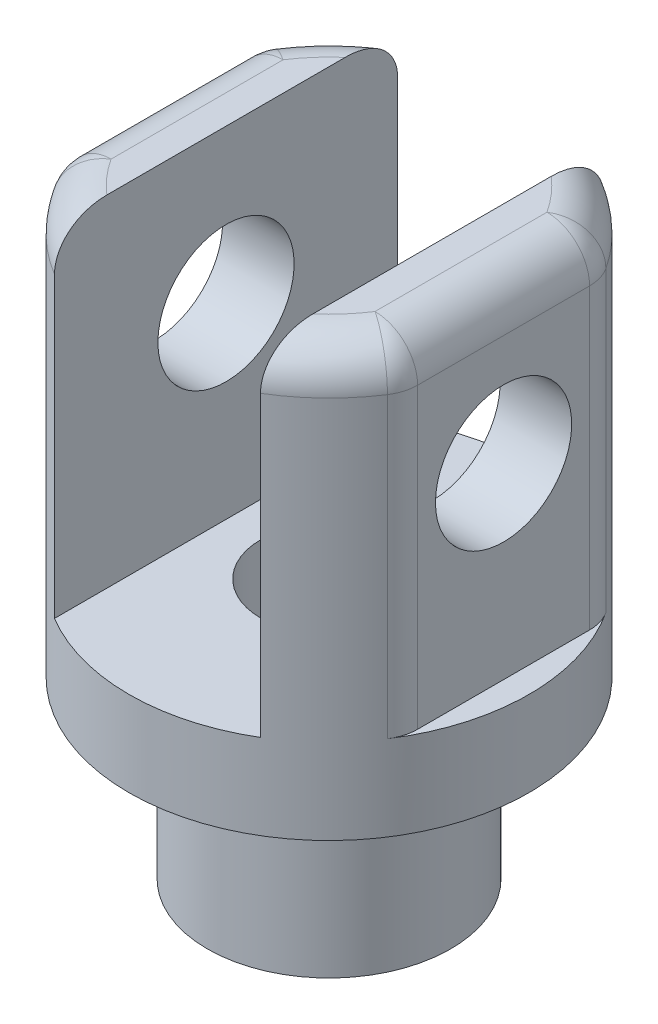
ISO-10303-21;
HEADER;
FILE_DESCRIPTION(('STEP AP214'),'2;1');
FILE_NAME('part.step','',(''),(''),'','','');
FILE_SCHEMA(('AUTOMOTIVE_DESIGN { 1 0 10303 214 1 1 1 1 }'));
ENDSEC;
DATA;
#1=APPLICATION_CONTEXT('core data for automotive mechanical design processes');
#2=APPLICATION_PROTOCOL_DEFINITION('international standard','automotive_design',2000,#1);
#3=PRODUCT_CONTEXT('',#1,'mechanical');
#4=PRODUCT('Part','Part','',(#3));
#5=PRODUCT_RELATED_PRODUCT_CATEGORY('part','',(#4));
#6=PRODUCT_DEFINITION_FORMATION('','',#4);
#7=PRODUCT_DEFINITION_CONTEXT('part definition',#1,'design');
#8=PRODUCT_DEFINITION('design','',#6,#7);
#9=PRODUCT_DEFINITION_SHAPE('','',#8);
#10=(LENGTH_UNIT() NAMED_UNIT(*) SI_UNIT(.MILLI.,.METRE.));
#11=(NAMED_UNIT(*) PLANE_ANGLE_UNIT() SI_UNIT($,.RADIAN.));
#12=(NAMED_UNIT(*) SI_UNIT($,.STERADIAN.) SOLID_ANGLE_UNIT());
#13=UNCERTAINTY_MEASURE_WITH_UNIT(LENGTH_MEASURE(1.E-05),#10,'distance_accuracy_value','');
#14=(GEOMETRIC_REPRESENTATION_CONTEXT(3) GLOBAL_UNCERTAINTY_ASSIGNED_CONTEXT((#13)) GLOBAL_UNIT_ASSIGNED_CONTEXT((#10,
#11,#12)) REPRESENTATION_CONTEXT('',''));
#15=CARTESIAN_POINT('',(0.,0.,0.));
#16=DIRECTION('',(0.,0.,1.));
#17=DIRECTION('',(1.,0.,0.));
#18=AXIS2_PLACEMENT_3D('',#15,#16,#17);
#19=CARTESIAN_POINT('',(0.,35.25,0.));
#20=DIRECTION('',(0.,-1.,0.));
#21=DIRECTION('',(0.,0.,-1.));
#22=AXIS2_PLACEMENT_3D('',#19,#20,#21);
#23=CYLINDRICAL_SURFACE('',#22,11.75);
#24=DIRECTION('',(0.,-1.,0.));
#25=VECTOR('',#24,1.);
#26=CARTESIAN_POINT('',(-9.8445945945946,35.25,-6.41455043382456));
#27=LINE('',#26,#25);
#28=CARTESIAN_POINT('',(-9.8445945945946,15.25,-6.41455043382456));
#29=VERTEX_POINT('',#28);
#30=CARTESIAN_POINT('',(-9.8445945945946,32.75,-6.41455043382456));
#31=VERTEX_POINT('',#30);
#32=EDGE_CURVE('E216',#29,#31,#27,.F.);
#33=ORIENTED_EDGE('',*,*,#32,.T.);
#34=CARTESIAN_POINT('',(0.,32.75,0.));
#35=DIRECTION('',(0.,1.,0.));
#36=DIRECTION('',(0.,0.,1.));
#37=AXIS2_PLACEMENT_3D('',#34,#35,#36);
#38=CIRCLE('',#37,11.75);
#39=CARTESIAN_POINT('',(-6.05,32.75,-10.0727354775155));
#40=VERTEX_POINT('',#39);
#41=EDGE_CURVE('E267',#31,#40,#38,.F.);
#42=ORIENTED_EDGE('',*,*,#41,.T.);
#43=DIRECTION('',(0.,1.,0.));
#44=VECTOR('',#43,1.);
#45=CARTESIAN_POINT('',(-6.05,15.25,-10.0727354775155));
#46=LINE('',#45,#44);
#47=CARTESIAN_POINT('',(-6.05,15.25,-10.0727354775155));
#48=VERTEX_POINT('',#47);
#49=EDGE_CURVE('E171',#48,#40,#46,.T.);
#50=ORIENTED_EDGE('',*,*,#49,.F.);
#51=CARTESIAN_POINT('',(0.,15.25,0.));
#52=DIRECTION('',(0.,1.,0.));
#53=DIRECTION('',(0.,0.,1.));
#54=AXIS2_PLACEMENT_3D('',#51,#52,#53);
#55=CIRCLE('',#54,11.75);
#56=CARTESIAN_POINT('',(6.05,15.25,-10.0727354775155));
#57=VERTEX_POINT('',#56);
#58=EDGE_CURVE('E179',#57,#48,#55,.T.);
#59=ORIENTED_EDGE('',*,*,#58,.F.);
#60=DIRECTION('',(0.,1.,0.));
#61=VECTOR('',#60,1.);
#62=CARTESIAN_POINT('',(6.05,15.25,-10.0727354775155));
#63=LINE('',#62,#61);
#64=CARTESIAN_POINT('',(6.05,32.75,-10.0727354775155));
#65=VERTEX_POINT('',#64);
#66=EDGE_CURVE('E160',#57,#65,#63,.T.);
#67=ORIENTED_EDGE('',*,*,#66,.T.);
#68=CARTESIAN_POINT('',(0.,32.75,0.));
#69=DIRECTION('',(0.,1.,0.));
#70=DIRECTION('',(0.,0.,1.));
#71=AXIS2_PLACEMENT_3D('',#68,#69,#70);
#72=CIRCLE('',#71,11.75);
#73=CARTESIAN_POINT('',(9.84459459459459,32.75,-6.41455043382457));
#74=VERTEX_POINT('',#73);
#75=EDGE_CURVE('E263',#65,#74,#72,.F.);
#76=ORIENTED_EDGE('',*,*,#75,.T.);
#77=DIRECTION('',(0.,-1.,0.));
#78=VECTOR('',#77,1.);
#79=CARTESIAN_POINT('',(9.84459459459459,35.25,-6.41455043382457));
#80=LINE('',#79,#78);
#81=CARTESIAN_POINT('',(9.84459459459459,15.25,-6.41455043382457));
#82=VERTEX_POINT('',#81);
#83=EDGE_CURVE('E229',#74,#82,#80,.T.);
#84=ORIENTED_EDGE('',*,*,#83,.T.);
#85=CARTESIAN_POINT('',(0.,15.25,0.));
#86=DIRECTION('',(0.,1.,0.));
#87=DIRECTION('',(0.,0.,1.));
#88=AXIS2_PLACEMENT_3D('',#85,#86,#87);
#89=CIRCLE('',#88,11.75);
#90=CARTESIAN_POINT('',(9.84459459459459,15.25,6.41455043382457));
#91=VERTEX_POINT('',#90);
#92=EDGE_CURVE('E435',#91,#82,#89,.T.);
#93=ORIENTED_EDGE('',*,*,#92,.F.);
#94=DIRECTION('',(0.,-1.,0.));
#95=VECTOR('',#94,1.);
#96=CARTESIAN_POINT('',(9.84459459459459,35.25,6.41455043382457));
#97=LINE('',#96,#95);
#98=CARTESIAN_POINT('',(9.84459459459459,32.75,6.41455043382457));
#99=VERTEX_POINT('',#98);
#100=EDGE_CURVE('E231',#91,#99,#97,.F.);
#101=ORIENTED_EDGE('',*,*,#100,.T.);
#102=CARTESIAN_POINT('',(0.,32.75,0.));
#103=DIRECTION('',(0.,1.,0.));
#104=DIRECTION('',(0.,0.,1.));
#105=AXIS2_PLACEMENT_3D('',#102,#103,#104);
#106=CIRCLE('',#105,11.75);
#107=CARTESIAN_POINT('',(6.05,32.75,10.0727354775155));
#108=VERTEX_POINT('',#107);
#109=EDGE_CURVE('E261',#99,#108,#106,.F.);
#110=ORIENTED_EDGE('',*,*,#109,.T.);
#111=DIRECTION('',(0.,1.,0.));
#112=VECTOR('',#111,1.);
#113=CARTESIAN_POINT('',(6.05,15.25,10.0727354775155));
#114=LINE('',#113,#112);
#115=CARTESIAN_POINT('',(6.05,15.25,10.0727354775155));
#116=VERTEX_POINT('',#115);
#117=EDGE_CURVE('E199',#116,#108,#114,.T.);
#118=ORIENTED_EDGE('',*,*,#117,.F.);
#119=CARTESIAN_POINT('',(-6.05,15.25,10.0727354775155));
#120=VERTEX_POINT('',#119);
#121=EDGE_CURVE('E172',#120,#116,#55,.T.);
#122=ORIENTED_EDGE('',*,*,#121,.F.);
#123=DIRECTION('',(0.,1.,0.));
#124=VECTOR('',#123,1.);
#125=CARTESIAN_POINT('',(-6.05,15.25,10.0727354775155));
#126=LINE('',#125,#124);
#127=CARTESIAN_POINT('',(-6.05,32.75,10.0727354775155));
#128=VERTEX_POINT('',#127);
#129=EDGE_CURVE('E202',#120,#128,#126,.T.);
#130=ORIENTED_EDGE('',*,*,#129,.T.);
#131=CARTESIAN_POINT('',(0.,32.75,0.));
#132=DIRECTION('',(0.,1.,0.));
#133=DIRECTION('',(0.,0.,1.));
#134=AXIS2_PLACEMENT_3D('',#131,#132,#133);
#135=CIRCLE('',#134,11.75);
#136=CARTESIAN_POINT('',(-9.8445945945946,32.75,6.41455043382456));
#137=VERTEX_POINT('',#136);
#138=EDGE_CURVE('E265',#128,#137,#135,.F.);
#139=ORIENTED_EDGE('',*,*,#138,.T.);
#140=DIRECTION('',(0.,-1.,0.));
#141=VECTOR('',#140,1.);
#142=CARTESIAN_POINT('',(-9.8445945945946,35.25,6.41455043382456));
#143=LINE('',#142,#141);
#144=CARTESIAN_POINT('',(-9.8445945945946,15.25,6.41455043382456));
#145=VERTEX_POINT('',#144);
#146=EDGE_CURVE('E227',#137,#145,#143,.T.);
#147=ORIENTED_EDGE('',*,*,#146,.T.);
#148=CARTESIAN_POINT('',(0.,15.25,0.));
#149=DIRECTION('',(0.,1.,0.));
#150=DIRECTION('',(0.,0.,1.));
#151=AXIS2_PLACEMENT_3D('',#148,#149,#150);
#152=CIRCLE('',#151,11.75);
#153=EDGE_CURVE('E196',#29,#145,#152,.T.);
#154=ORIENTED_EDGE('',*,*,#153,.F.);
#155=EDGE_LOOP('',(#33,#42,#50,#59,#67,#76,#84,#93,#101,#110,#118,#122,#130,#139,#147,#154));
#156=FACE_BOUND('',#155,.T.);
#157=CARTESIAN_POINT('',(0.,10.25,0.));
#158=DIRECTION('',(0.,1.,0.));
#159=DIRECTION('',(0.,0.,1.));
#160=AXIS2_PLACEMENT_3D('',#157,#158,#159);
#161=CIRCLE('',#160,11.75);
#162=CARTESIAN_POINT('',(0.,10.25,11.75));
#163=VERTEX_POINT('',#162);
#164=EDGE_CURVE('E209',#163,#163,#161,.T.);
#165=ORIENTED_EDGE('',*,*,#164,.T.);
#166=EDGE_LOOP('',(#165));
#167=FACE_BOUND('',#166,.T.);
#168=ADVANCED_FACE('F45',(#156,#167),#23,.T.);
#169=CARTESIAN_POINT('',(0.,35.25,0.));
#170=DIRECTION('',(0.,1.,0.));
#171=DIRECTION('',(0.,0.,1.));
#172=AXIS2_PLACEMENT_3D('',#169,#170,#171);
#173=PLANE('',#172);
#174=DIRECTION('',(0.,0.,1.));
#175=VECTOR('',#174,1.);
#176=CARTESIAN_POINT('',(-6.05,35.25,0.));
#177=LINE('',#176,#175);
#178=CARTESIAN_POINT('',(-6.05,35.25,-6.99714227381436));
#179=VERTEX_POINT('',#178);
#180=CARTESIAN_POINT('',(-6.05,35.25,6.99714227381436));
#181=VERTEX_POINT('',#180);
#182=EDGE_CURVE('E183',#179,#181,#177,.T.);
#183=ORIENTED_EDGE('',*,*,#182,.F.);
#184=CARTESIAN_POINT('',(0.,35.25,0.));
#185=DIRECTION('',(0.,1.,0.));
#186=DIRECTION('',(0.,0.,1.));
#187=AXIS2_PLACEMENT_3D('',#184,#185,#186);
#188=CIRCLE('',#187,9.25);
#189=CARTESIAN_POINT('',(-7.75,35.25,-5.04975246918104));
#190=VERTEX_POINT('',#189);
#191=EDGE_CURVE('E258',#179,#190,#188,.T.);
#192=ORIENTED_EDGE('',*,*,#191,.T.);
#193=DIRECTION('',(0.,0.,1.));
#194=VECTOR('',#193,1.);
#195=CARTESIAN_POINT('',(-7.75,35.25,0.));
#196=LINE('',#195,#194);
#197=CARTESIAN_POINT('',(-7.75,35.25,5.04975246918104));
#198=VERTEX_POINT('',#197);
#199=EDGE_CURVE('E254',#190,#198,#196,.T.);
#200=ORIENTED_EDGE('',*,*,#199,.T.);
#201=CARTESIAN_POINT('',(0.,35.25,0.));
#202=DIRECTION('',(0.,1.,0.));
#203=DIRECTION('',(0.,0.,1.));
#204=AXIS2_PLACEMENT_3D('',#201,#202,#203);
#205=CIRCLE('',#204,9.25);
#206=EDGE_CURVE('E256',#198,#181,#205,.T.);
#207=ORIENTED_EDGE('',*,*,#206,.T.);
#208=EDGE_LOOP('',(#183,#192,#200,#207));
#209=FACE_BOUND('',#208,.T.);
#210=ADVANCED_FACE('F336',(#209),#173,.T.);
#211=DIRECTION('',(0.,0.,1.));
#212=VECTOR('',#211,1.);
#213=CARTESIAN_POINT('',(7.75,35.25,-5.04975246918104));
#214=LINE('',#213,#212);
#215=CARTESIAN_POINT('',(7.75,35.25,5.04975246918104));
#216=VERTEX_POINT('',#215);
#217=CARTESIAN_POINT('',(7.75,35.25,-5.04975246918104));
#218=VERTEX_POINT('',#217);
#219=EDGE_CURVE('E398',#216,#218,#214,.F.);
#220=ORIENTED_EDGE('',*,*,#219,.T.);
#221=CARTESIAN_POINT('',(0.,35.25,0.));
#222=DIRECTION('',(0.,1.,0.));
#223=DIRECTION('',(0.,0.,1.));
#224=AXIS2_PLACEMENT_3D('',#221,#222,#223);
#225=CIRCLE('',#224,9.25);
#226=CARTESIAN_POINT('',(6.05,35.25,-6.99714227381436));
#227=VERTEX_POINT('',#226);
#228=EDGE_CURVE('E404',#218,#227,#225,.T.);
#229=ORIENTED_EDGE('',*,*,#228,.T.);
#230=DIRECTION('',(0.,0.,1.));
#231=VECTOR('',#230,1.);
#232=CARTESIAN_POINT('',(6.05,35.25,0.));
#233=LINE('',#232,#231);
#234=CARTESIAN_POINT('',(6.05,35.25,6.99714227381436));
#235=VERTEX_POINT('',#234);
#236=EDGE_CURVE('E193',#227,#235,#233,.T.);
#237=ORIENTED_EDGE('',*,*,#236,.T.);
#238=CARTESIAN_POINT('',(0.,35.25,0.));
#239=DIRECTION('',(0.,1.,0.));
#240=DIRECTION('',(0.,0.,1.));
#241=AXIS2_PLACEMENT_3D('',#238,#239,#240);
#242=CIRCLE('',#241,9.25);
#243=EDGE_CURVE('E401',#235,#216,#242,.T.);
#244=ORIENTED_EDGE('',*,*,#243,.T.);
#245=EDGE_LOOP('',(#220,#229,#237,#244));
#246=FACE_BOUND('',#245,.T.);
#247=ADVANCED_FACE('F341',(#246),#173,.T.);
#248=CARTESIAN_POINT('',(0.,20.,0.));
#249=DIRECTION('',(0.,-1.,0.));
#250=DIRECTION('',(0.,0.,-1.));
#251=AXIS2_PLACEMENT_3D('',#248,#249,#250);
#252=CYLINDRICAL_SURFACE('',#251,4.);
#253=CARTESIAN_POINT('',(0.,0.,0.));
#254=DIRECTION('',(0.,-1.,0.));
#255=DIRECTION('',(0.,0.,-1.));
#256=AXIS2_PLACEMENT_3D('',#253,#254,#255);
#257=CIRCLE('',#256,4.);
#258=CARTESIAN_POINT('',(0.,0.,-4.));
#259=VERTEX_POINT('',#258);
#260=EDGE_CURVE('E206',#259,#259,#257,.T.);
#261=ORIENTED_EDGE('',*,*,#260,.T.);
#262=EDGE_LOOP('',(#261));
#263=FACE_BOUND('',#262,.T.);
#264=CARTESIAN_POINT('',(0.,15.25,0.));
#265=DIRECTION('',(0.,1.,0.));
#266=DIRECTION('',(0.,0.,1.));
#267=AXIS2_PLACEMENT_3D('',#264,#265,#266);
#268=CIRCLE('',#267,4.);
#269=CARTESIAN_POINT('',(0.,15.25,4.));
#270=VERTEX_POINT('',#269);
#271=EDGE_CURVE('E201',#270,#270,#268,.F.);
#272=ORIENTED_EDGE('',*,*,#271,.F.);
#273=EDGE_LOOP('',(#272));
#274=FACE_BOUND('',#273,.T.);
#275=ADVANCED_FACE('F299',(#263,#274),#252,.F.);
#276=CARTESIAN_POINT('',(0.,10.25,0.));
#277=DIRECTION('',(0.,-1.,0.));
#278=DIRECTION('',(0.,0.,-1.));
#279=AXIS2_PLACEMENT_3D('',#276,#277,#278);
#280=CYLINDRICAL_SURFACE('',#279,7.14375);
#281=CARTESIAN_POINT('',(0.,10.25,0.));
#282=DIRECTION('',(0.,1.,0.));
#283=DIRECTION('',(0.,0.,1.));
#284=AXIS2_PLACEMENT_3D('',#281,#282,#283);
#285=CIRCLE('',#284,7.14375);
#286=CARTESIAN_POINT('',(0.,10.25,7.14375));
#287=VERTEX_POINT('',#286);
#288=EDGE_CURVE('E213',#287,#287,#285,.T.);
#289=ORIENTED_EDGE('',*,*,#288,.F.);
#290=EDGE_LOOP('',(#289));
#291=FACE_BOUND('',#290,.T.);
#292=CARTESIAN_POINT('',(0.,0.,0.));
#293=DIRECTION('',(0.,1.,0.));
#294=DIRECTION('',(0.,0.,1.));
#295=AXIS2_PLACEMENT_3D('',#292,#293,#294);
#296=CIRCLE('',#295,7.14375);
#297=CARTESIAN_POINT('',(0.,0.,7.14375));
#298=VERTEX_POINT('',#297);
#299=EDGE_CURVE('E212',#298,#298,#296,.T.);
#300=ORIENTED_EDGE('',*,*,#299,.T.);
#301=EDGE_LOOP('',(#300));
#302=FACE_BOUND('',#301,.T.);
#303=ADVANCED_FACE('F349',(#291,#302),#280,.T.);
#304=CARTESIAN_POINT('',(0.,0.,0.));
#305=DIRECTION('',(0.,1.,0.));
#306=DIRECTION('',(0.,0.,1.));
#307=AXIS2_PLACEMENT_3D('',#304,#305,#306);
#308=PLANE('',#307);
#309=ORIENTED_EDGE('',*,*,#260,.F.);
#310=EDGE_LOOP('',(#309));
#311=FACE_BOUND('',#310,.T.);
#312=ORIENTED_EDGE('',*,*,#299,.F.);
#313=EDGE_LOOP('',(#312));
#314=FACE_BOUND('',#313,.T.);
#315=ADVANCED_FACE('F346',(#311,#314),#308,.F.);
#316=CARTESIAN_POINT('',(0.,10.25,0.));
#317=DIRECTION('',(0.,1.,0.));
#318=DIRECTION('',(0.,0.,1.));
#319=AXIS2_PLACEMENT_3D('',#316,#317,#318);
#320=PLANE('',#319);
#321=ORIENTED_EDGE('',*,*,#288,.T.);
#322=EDGE_LOOP('',(#321));
#323=FACE_BOUND('',#322,.T.);
#324=ORIENTED_EDGE('',*,*,#164,.F.);
#325=EDGE_LOOP('',(#324));
#326=FACE_BOUND('',#325,.T.);
#327=ADVANCED_FACE('F345',(#323,#326),#320,.F.);
#328=CARTESIAN_POINT('',(0.,15.25,0.));
#329=DIRECTION('',(0.,1.,0.));
#330=DIRECTION('',(0.,0.,1.));
#331=AXIS2_PLACEMENT_3D('',#328,#329,#330);
#332=PLANE('',#331);
#333=DIRECTION('',(0.,0.,1.));
#334=VECTOR('',#333,1.);
#335=CARTESIAN_POINT('',(6.05,15.25,0.));
#336=LINE('',#335,#334);
#337=EDGE_CURVE('E165',#57,#116,#336,.T.);
#338=ORIENTED_EDGE('',*,*,#337,.F.);
#339=ORIENTED_EDGE('',*,*,#58,.T.);
#340=DIRECTION('',(0.,0.,1.));
#341=VECTOR('',#340,1.);
#342=CARTESIAN_POINT('',(-6.05,15.25,0.));
#343=LINE('',#342,#341);
#344=EDGE_CURVE('E188',#48,#120,#343,.T.);
#345=ORIENTED_EDGE('',*,*,#344,.T.);
#346=ORIENTED_EDGE('',*,*,#121,.T.);
#347=EDGE_LOOP('',(#338,#339,#345,#346));
#348=FACE_BOUND('',#347,.T.);
#349=ORIENTED_EDGE('',*,*,#271,.T.);
#350=EDGE_LOOP('',(#349));
#351=FACE_BOUND('',#350,.T.);
#352=ADVANCED_FACE('F176',(#348,#351),#332,.T.);
#353=CARTESIAN_POINT('',(6.05,15.25,0.));
#354=DIRECTION('',(-1.,0.,0.));
#355=DIRECTION('',(0.,0.,1.));
#356=AXIS2_PLACEMENT_3D('',#353,#354,#355);
#357=PLANE('',#356);
#358=CARTESIAN_POINT('',(6.05,26.25,0.));
#359=DIRECTION('',(-1.,0.,0.));
#360=DIRECTION('',(0.,0.,1.));
#361=AXIS2_PLACEMENT_3D('',#358,#359,#360);
#362=CIRCLE('',#361,4.);
#363=CARTESIAN_POINT('',(6.05,26.25,4.));
#364=VERTEX_POINT('',#363);
#365=EDGE_CURVE('E440',#364,#364,#362,.T.);
#366=ORIENTED_EDGE('',*,*,#365,.F.);
#367=EDGE_LOOP('',(#366));
#368=FACE_BOUND('',#367,.T.);
#369=ORIENTED_EDGE('',*,*,#236,.F.);
#370=CARTESIAN_POINT('',(6.05,35.25,-6.99714227381436));
#371=CARTESIAN_POINT('',(6.05,35.2499855718566,-7.10268320310536));
#372=CARTESIAN_POINT('',(6.05,35.2461708834123,-7.20818973242861));
#373=CARTESIAN_POINT('',(6.05,35.2304379650057,-7.41874620377259));
#374=CARTESIAN_POINT('',(6.05,35.2185078138945,-7.52379524499202));
#375=CARTESIAN_POINT('',(6.05,35.1696330531424,-7.83829983358186));
#376=CARTESIAN_POINT('',(6.05,35.1195933500312,-8.04599356671882));
#377=CARTESIAN_POINT('',(6.05,34.996704810854,-8.40449181292973));
#378=CARTESIAN_POINT('',(6.05,34.9311950856134,-8.5578363030037));
#379=CARTESIAN_POINT('',(6.05,34.7761496262352,-8.85178084345603));
#380=CARTESIAN_POINT('',(6.05,34.6866681494701,-8.99240872669526));
#381=CARTESIAN_POINT('',(6.05,34.5342406088545,-9.19019732393568));
#382=CARTESIAN_POINT('',(6.05,34.4800600530475,-9.2542390889218));
#383=CARTESIAN_POINT('',(6.05,34.3658546787875,-9.37686201270919));
#384=CARTESIAN_POINT('',(6.05,34.3058330868242,-9.435446151596));
#385=CARTESIAN_POINT('',(6.05,34.1802228828568,-9.54636132867012));
#386=CARTESIAN_POINT('',(6.05,34.114632370534,-9.59869021755197));
#387=CARTESIAN_POINT('',(6.05,33.9783679266597,-9.69624394988151));
#388=CARTESIAN_POINT('',(6.05,33.9076952913854,-9.74147059556608));
#389=CARTESIAN_POINT('',(6.05,33.7726424808319,-9.81795009339649));
#390=CARTESIAN_POINT('',(6.05,33.7088704624277,-9.85028006207633));
#391=CARTESIAN_POINT('',(6.05,33.5785609901714,-9.90876825143644));
#392=CARTESIAN_POINT('',(6.05,33.5120240786577,-9.93492767582044));
#393=CARTESIAN_POINT('',(6.05,33.3768758318821,-9.98064991212124));
#394=CARTESIAN_POINT('',(6.05,33.3082691441341,-10.0002264554874));
#395=CARTESIAN_POINT('',(6.05,33.1694993815219,-10.0325510009105));
#396=CARTESIAN_POINT('',(6.05,33.0993373313713,-10.0453033673858));
#397=CARTESIAN_POINT('',(6.05,32.9825001965368,-10.0606025796408));
#398=CARTESIAN_POINT('',(6.05,32.9360784077403,-10.0651527757472));
#399=CARTESIAN_POINT('',(6.05,32.843106738666,-10.0712182094448));
#400=CARTESIAN_POINT('',(6.05,32.7965571532015,-10.0727379691768));
#401=CARTESIAN_POINT('',(6.05,32.75,-10.0727354775155));
#402=B_SPLINE_CURVE_WITH_KNOTS('',3,(#370,#371,#372,#373,#374,#375,#376,#377,#378,#379,#380,
#381,#382,#383,#384,#385,#386,#387,#388,#389,#390,#391,#392,#393,#394,#395,#396,#397,#398,#399,
#400,#401),.UNSPECIFIED.,.F.,.F.,(4,2,2,2,2,2,2,2,2,2,2,2,2,2,2,4),(0.,0.316464236735058,
0.633394347982371,1.27057627377181,1.7690148856988,2.26633473224147,2.51767902102997,
2.76888525116085,3.02017754921063,3.27140597692824,3.48560025780151,3.69975272063464,
3.91345566381292,4.12702176893239,4.26686251657105,4.40649443151552),.UNSPECIFIED.);
#403=EDGE_CURVE('E167',#227,#65,#402,.T.);
#404=ORIENTED_EDGE('',*,*,#403,.T.);
#405=ORIENTED_EDGE('',*,*,#66,.F.);
#406=ORIENTED_EDGE('',*,*,#337,.T.);
#407=ORIENTED_EDGE('',*,*,#117,.T.);
#408=CARTESIAN_POINT('',(6.05,32.75,10.0727354775155));
#409=CARTESIAN_POINT('',(6.05,32.8126573417187,10.0727467964401));
#410=CARTESIAN_POINT('',(6.05,32.875309142697,10.0699879508154));
#411=CARTESIAN_POINT('',(6.05,33.0001159532613,10.0590166479569));
#412=CARTESIAN_POINT('',(6.05,33.0622711000083,10.0508057530892));
#413=CARTESIAN_POINT('',(6.05,33.1853907945542,10.0290601667842));
#414=CARTESIAN_POINT('',(6.05,33.2463590854619,10.0155467097253));
#415=CARTESIAN_POINT('',(6.05,33.3669057887156,9.98337145862356));
#416=CARTESIAN_POINT('',(6.05,33.4264841557246,9.96470949689913));
#417=CARTESIAN_POINT('',(6.05,33.6024329270095,9.90132625144927));
#418=CARTESIAN_POINT('',(6.05,33.7162138086614,9.84917213838896));
#419=CARTESIAN_POINT('',(6.05,33.9339056349498,9.72729909431048));
#420=CARTESIAN_POINT('',(6.05,34.0378088558349,9.65756657107518));
#421=CARTESIAN_POINT('',(6.05,34.2382027337251,9.49970997728512));
#422=CARTESIAN_POINT('',(6.05,34.3341536489224,9.4109025600752));
#423=CARTESIAN_POINT('',(6.05,34.5118008530402,9.22015583393917));
#424=CARTESIAN_POINT('',(6.05,34.5934984495402,9.11821773109669));
#425=CARTESIAN_POINT('',(6.05,34.7517691787605,8.89024134699048));
#426=CARTESIAN_POINT('',(6.05,34.8263055549167,8.76279188841026));
#427=CARTESIAN_POINT('',(6.05,34.956711783627,8.49847089915));
#428=CARTESIAN_POINT('',(6.05,35.0125378303207,8.3615781495744));
#429=CARTESIAN_POINT('',(6.05,35.1251570056812,8.02436630904899));
#430=CARTESIAN_POINT('',(6.05,35.1730007018969,7.82101227997337));
#431=CARTESIAN_POINT('',(6.05,35.2197977323923,7.51309142035111));
#432=CARTESIAN_POINT('',(6.05,35.2312370894749,7.41016283165226));
#433=CARTESIAN_POINT('',(6.05,35.2463258224104,7.20388129336831));
#434=CARTESIAN_POINT('',(6.05,35.2499865633879,7.10052918426119));
#435=CARTESIAN_POINT('',(6.05,35.25,6.99714227381437));
#436=B_SPLINE_CURVE_WITH_KNOTS('',3,(#408,#409,#410,#411,#412,#413,#414,#415,#416,#417,#418,
#419,#420,#421,#422,#423,#424,#425,#426,#427,#428,#429,#430,#431,#432,#433,#434,#435),
.UNSPECIFIED.,.F.,.F.,(4,2,2,2,2,2,2,2,2,2,2,2,2,4),(0.,0.187901981726544,0.37575014055684,
0.562853605540505,0.749963165013083,1.12359002284997,1.49750667247147,1.88815512737838,
2.27876772588001,2.72000995695813,3.16227815228011,3.78549668065476,4.09595778831879,
4.40596497690343),.UNSPECIFIED.);
#437=EDGE_CURVE('E303',#108,#235,#436,.T.);
#438=ORIENTED_EDGE('',*,*,#437,.T.);
#439=EDGE_LOOP('',(#369,#404,#405,#406,#407,#438));
#440=FACE_BOUND('',#439,.T.);
#441=ADVANCED_FACE('F163',(#368,#440),#357,.T.);
#442=CARTESIAN_POINT('',(-6.05,15.25,0.));
#443=DIRECTION('',(-1.,0.,0.));
#444=DIRECTION('',(0.,0.,1.));
#445=AXIS2_PLACEMENT_3D('',#442,#443,#444);
#446=PLANE('',#445);
#447=CARTESIAN_POINT('',(-6.05,26.25,0.));
#448=DIRECTION('',(-1.,0.,0.));
#449=DIRECTION('',(0.,0.,1.));
#450=AXIS2_PLACEMENT_3D('',#447,#448,#449);
#451=CIRCLE('',#450,4.);
#452=CARTESIAN_POINT('',(-6.05,26.25,4.));
#453=VERTEX_POINT('',#452);
#454=EDGE_CURVE('E224',#453,#453,#451,.T.);
#455=ORIENTED_EDGE('',*,*,#454,.T.);
#456=EDGE_LOOP('',(#455));
#457=FACE_BOUND('',#456,.T.);
#458=ORIENTED_EDGE('',*,*,#49,.T.);
#459=CARTESIAN_POINT('',(-6.05,32.75,-10.0727354775155));
#460=CARTESIAN_POINT('',(-6.05,32.8126573417187,-10.0727467964401));
#461=CARTESIAN_POINT('',(-6.05,32.875309142697,-10.0699879508154));
#462=CARTESIAN_POINT('',(-6.05,33.0001159532613,-10.0590166479569));
#463=CARTESIAN_POINT('',(-6.05,33.0622711000083,-10.0508057530892));
#464=CARTESIAN_POINT('',(-6.05,33.1853907945542,-10.0290601667842));
#465=CARTESIAN_POINT('',(-6.05,33.2463590854619,-10.0155467097253));
#466=CARTESIAN_POINT('',(-6.05,33.3669057887156,-9.98337145862356));
#467=CARTESIAN_POINT('',(-6.05,33.4264841557246,-9.96470949689913));
#468=CARTESIAN_POINT('',(-6.05,33.6024329270095,-9.90132625144927));
#469=CARTESIAN_POINT('',(-6.05,33.7162138086614,-9.84917213838896));
#470=CARTESIAN_POINT('',(-6.05,33.9339056349498,-9.72729909431048));
#471=CARTESIAN_POINT('',(-6.05,34.0378088558349,-9.65756657107518));
#472=CARTESIAN_POINT('',(-6.05,34.2382027337251,-9.49970997728511));
#473=CARTESIAN_POINT('',(-6.05,34.3341536489224,-9.4109025600752));
#474=CARTESIAN_POINT('',(-6.05,34.5118008530402,-9.22015583393917));
#475=CARTESIAN_POINT('',(-6.05,34.5934984495402,-9.11821773109668));
#476=CARTESIAN_POINT('',(-6.05,34.7517691787605,-8.89024134699048));
#477=CARTESIAN_POINT('',(-6.05,34.8263055549167,-8.76279188841026));
#478=CARTESIAN_POINT('',(-6.05,34.956711783627,-8.49847089915));
#479=CARTESIAN_POINT('',(-6.05,35.0125378303207,-8.36157814957439));
#480=CARTESIAN_POINT('',(-6.05,35.1251570056812,-8.02436630904899));
#481=CARTESIAN_POINT('',(-6.05,35.1730007018969,-7.82101227997337));
#482=CARTESIAN_POINT('',(-6.05,35.2197977323923,-7.51309142035111));
#483=CARTESIAN_POINT('',(-6.05,35.2312370894749,-7.41016283165226));
#484=CARTESIAN_POINT('',(-6.05,35.2463258224104,-7.20388129336831));
#485=CARTESIAN_POINT('',(-6.05,35.2499865633879,-7.10052918426118));
#486=CARTESIAN_POINT('',(-6.05,35.25,-6.99714227381436));
#487=B_SPLINE_CURVE_WITH_KNOTS('',3,(#459,#460,#461,#462,#463,#464,#465,#466,#467,#468,#469,
#470,#471,#472,#473,#474,#475,#476,#477,#478,#479,#480,#481,#482,#483,#484,#485,#486),
.UNSPECIFIED.,.F.,.F.,(4,2,2,2,2,2,2,2,2,2,2,2,2,4),(0.,0.187901981726545,0.375750140556841,
0.562853605540505,0.749963165013083,1.12359002284997,1.49750667247147,1.88815512737838,
2.27876772588001,2.72000995695812,3.1622781522801,3.78549668065476,4.09595778831879,
4.40596497690343),.UNSPECIFIED.);
#488=EDGE_CURVE('E276',#40,#179,#487,.T.);
#489=ORIENTED_EDGE('',*,*,#488,.T.);
#490=ORIENTED_EDGE('',*,*,#182,.T.);
#491=CARTESIAN_POINT('',(-6.05,35.25,6.99714227381436));
#492=CARTESIAN_POINT('',(-6.05,35.2499855718566,7.10268320310536));
#493=CARTESIAN_POINT('',(-6.05,35.2461708834123,7.20818973242861));
#494=CARTESIAN_POINT('',(-6.05,35.2304379650057,7.41874620377259));
#495=CARTESIAN_POINT('',(-6.05,35.2185078138945,7.52379524499202));
#496=CARTESIAN_POINT('',(-6.05,35.1696330531424,7.83829983358186));
#497=CARTESIAN_POINT('',(-6.05,35.1195933500312,8.04599356671882));
#498=CARTESIAN_POINT('',(-6.05,34.996704810854,8.40449181292973));
#499=CARTESIAN_POINT('',(-6.05,34.9311950856134,8.5578363030037));
#500=CARTESIAN_POINT('',(-6.05,34.7761496262352,8.85178084345603));
#501=CARTESIAN_POINT('',(-6.05,34.6866681494701,8.99240872669526));
#502=CARTESIAN_POINT('',(-6.05,34.5342406088545,9.19019732393568));
#503=CARTESIAN_POINT('',(-6.05,34.4800600530475,9.2542390889218));
#504=CARTESIAN_POINT('',(-6.05,34.3658546787875,9.37686201270919));
#505=CARTESIAN_POINT('',(-6.05,34.3058330868242,9.435446151596));
#506=CARTESIAN_POINT('',(-6.05,34.1802228828568,9.54636132867012));
#507=CARTESIAN_POINT('',(-6.05,34.114632370534,9.59869021755197));
#508=CARTESIAN_POINT('',(-6.05,33.9783679266597,9.69624394988151));
#509=CARTESIAN_POINT('',(-6.05,33.9076952913854,9.74147059556608));
#510=CARTESIAN_POINT('',(-6.05,33.7726424808319,9.81795009339649));
#511=CARTESIAN_POINT('',(-6.05,33.7088704624277,9.85028006207633));
#512=CARTESIAN_POINT('',(-6.05,33.5785609901714,9.90876825143644));
#513=CARTESIAN_POINT('',(-6.05,33.5120240786577,9.93492767582044));
#514=CARTESIAN_POINT('',(-6.05,33.3768758318821,9.98064991212124));
#515=CARTESIAN_POINT('',(-6.05,33.3082691441341,10.0002264554874));
#516=CARTESIAN_POINT('',(-6.05,33.1694993815219,10.0325510009105));
#517=CARTESIAN_POINT('',(-6.05,33.0993373313713,10.0453033673858));
#518=CARTESIAN_POINT('',(-6.05,32.9825001965368,10.0606025796408));
#519=CARTESIAN_POINT('',(-6.05,32.9360784077403,10.0651527757472));
#520=CARTESIAN_POINT('',(-6.05,32.843106738666,10.0712182094448));
#521=CARTESIAN_POINT('',(-6.05,32.7965571532015,10.0727379691768));
#522=CARTESIAN_POINT('',(-6.05,32.75,10.0727354775155));
#523=B_SPLINE_CURVE_WITH_KNOTS('',3,(#491,#492,#493,#494,#495,#496,#497,#498,#499,#500,#501,
#502,#503,#504,#505,#506,#507,#508,#509,#510,#511,#512,#513,#514,#515,#516,#517,#518,#519,#520,
#521,#522),.UNSPECIFIED.,.F.,.F.,(4,2,2,2,2,2,2,2,2,2,2,2,2,2,2,4),(0.,0.316464236735058,
0.633394347982371,1.27057627377181,1.7690148856988,2.26633473224147,2.51767902102997,
2.76888525116085,3.02017754921063,3.27140597692824,3.48560025780151,3.69975272063464,
3.91345566381292,4.12702176893239,4.26686251657105,4.40649443151552),.UNSPECIFIED.);
#524=EDGE_CURVE('E269',#181,#128,#523,.T.);
#525=ORIENTED_EDGE('',*,*,#524,.T.);
#526=ORIENTED_EDGE('',*,*,#129,.F.);
#527=ORIENTED_EDGE('',*,*,#344,.F.);
#528=EDGE_LOOP('',(#458,#489,#490,#525,#526,#527));
#529=FACE_BOUND('',#528,.T.);
#530=ADVANCED_FACE('F286',(#457,#529),#446,.F.);
#531=CARTESIAN_POINT('',(-10.25,15.25,0.));
#532=DIRECTION('',(-1.,0.,0.));
#533=DIRECTION('',(0.,0.,1.));
#534=AXIS2_PLACEMENT_3D('',#531,#532,#533);
#535=PLANE('',#534);
#536=CARTESIAN_POINT('',(-10.25,26.25,0.));
#537=DIRECTION('',(-1.,0.,0.));
#538=DIRECTION('',(0.,0.,1.));
#539=AXIS2_PLACEMENT_3D('',#536,#537,#538);
#540=CIRCLE('',#539,4.);
#541=CARTESIAN_POINT('',(-10.25,26.25,4.));
#542=VERTEX_POINT('',#541);
#543=EDGE_CURVE('E225',#542,#542,#540,.T.);
#544=ORIENTED_EDGE('',*,*,#543,.F.);
#545=EDGE_LOOP('',(#544));
#546=FACE_BOUND('',#545,.T.);
#547=DIRECTION('',(0.,1.,0.));
#548=VECTOR('',#547,1.);
#549=CARTESIAN_POINT('',(-10.25,35.25,5.04975246918104));
#550=LINE('',#549,#548);
#551=CARTESIAN_POINT('',(-10.25,15.25,5.04975246918104));
#552=VERTEX_POINT('',#551);
#553=CARTESIAN_POINT('',(-10.25,32.75,5.04975246918104));
#554=VERTEX_POINT('',#553);
#555=EDGE_CURVE('E241',#552,#554,#550,.T.);
#556=ORIENTED_EDGE('',*,*,#555,.T.);
#557=DIRECTION('',(0.,0.,1.));
#558=VECTOR('',#557,1.);
#559=CARTESIAN_POINT('',(-10.25,32.75,0.));
#560=LINE('',#559,#558);
#561=CARTESIAN_POINT('',(-10.25,32.75,-5.04975246918104));
#562=VERTEX_POINT('',#561);
#563=EDGE_CURVE('E55',#554,#562,#560,.F.);
#564=ORIENTED_EDGE('',*,*,#563,.T.);
#565=DIRECTION('',(0.,1.,0.));
#566=VECTOR('',#565,1.);
#567=CARTESIAN_POINT('',(-10.25,15.25,-5.04975246918104));
#568=LINE('',#567,#566);
#569=CARTESIAN_POINT('',(-10.25,15.25,-5.04975246918104));
#570=VERTEX_POINT('',#569);
#571=EDGE_CURVE('E238',#562,#570,#568,.F.);
#572=ORIENTED_EDGE('',*,*,#571,.T.);
#573=DIRECTION('',(0.,0.,1.));
#574=VECTOR('',#573,1.);
#575=CARTESIAN_POINT('',(-10.25,15.25,0.));
#576=LINE('',#575,#574);
#577=EDGE_CURVE('E437',#570,#552,#576,.T.);
#578=ORIENTED_EDGE('',*,*,#577,.T.);
#579=EDGE_LOOP('',(#556,#564,#572,#578));
#580=FACE_BOUND('',#579,.T.);
#581=ADVANCED_FACE('F291',(#546,#580),#535,.T.);
#582=CARTESIAN_POINT('',(0.,15.25,0.));
#583=DIRECTION('',(0.,1.,0.));
#584=DIRECTION('',(0.,0.,1.));
#585=AXIS2_PLACEMENT_3D('',#582,#583,#584);
#586=PLANE('',#585);
#587=ORIENTED_EDGE('',*,*,#577,.F.);
#588=CARTESIAN_POINT('',(-7.75,15.25,-5.04975246918104));
#589=DIRECTION('',(0.,1.,0.));
#590=DIRECTION('',(0.,0.,1.));
#591=AXIS2_PLACEMENT_3D('',#588,#589,#590);
#592=CIRCLE('',#591,2.5);
#593=EDGE_CURVE('E251',#570,#29,#592,.F.);
#594=ORIENTED_EDGE('',*,*,#593,.T.);
#595=ORIENTED_EDGE('',*,*,#153,.T.);
#596=CARTESIAN_POINT('',(-7.75,15.25,5.04975246918104));
#597=DIRECTION('',(0.,1.,0.));
#598=DIRECTION('',(0.,0.,1.));
#599=AXIS2_PLACEMENT_3D('',#596,#597,#598);
#600=CIRCLE('',#599,2.5);
#601=EDGE_CURVE('E249',#145,#552,#600,.F.);
#602=ORIENTED_EDGE('',*,*,#601,.T.);
#603=EDGE_LOOP('',(#587,#594,#595,#602));
#604=FACE_BOUND('',#603,.T.);
#605=ADVANCED_FACE('F478',(#604),#586,.T.);
#606=CARTESIAN_POINT('',(10.25,15.25,0.));
#607=DIRECTION('',(-1.,0.,0.));
#608=DIRECTION('',(0.,0.,1.));
#609=AXIS2_PLACEMENT_3D('',#606,#607,#608);
#610=PLANE('',#609);
#611=CARTESIAN_POINT('',(10.25,26.25,0.));
#612=DIRECTION('',(-1.,0.,0.));
#613=DIRECTION('',(0.,0.,1.));
#614=AXIS2_PLACEMENT_3D('',#611,#612,#613);
#615=CIRCLE('',#614,4.);
#616=CARTESIAN_POINT('',(10.25,26.25,4.));
#617=VERTEX_POINT('',#616);
#618=EDGE_CURVE('E221',#617,#617,#615,.T.);
#619=ORIENTED_EDGE('',*,*,#618,.T.);
#620=EDGE_LOOP('',(#619));
#621=FACE_BOUND('',#620,.T.);
#622=DIRECTION('',(0.,-1.,0.));
#623=VECTOR('',#622,1.);
#624=CARTESIAN_POINT('',(10.25,15.25,-5.04975246918104));
#625=LINE('',#624,#623);
#626=CARTESIAN_POINT('',(10.25,15.25,-5.04975246918104));
#627=VERTEX_POINT('',#626);
#628=CARTESIAN_POINT('',(10.25,32.75,-5.04975246918104));
#629=VERTEX_POINT('',#628);
#630=EDGE_CURVE('E234',#627,#629,#625,.F.);
#631=ORIENTED_EDGE('',*,*,#630,.T.);
#632=DIRECTION('',(0.,0.,1.));
#633=VECTOR('',#632,1.);
#634=CARTESIAN_POINT('',(10.25,32.75,5.04975246918104));
#635=LINE('',#634,#633);
#636=CARTESIAN_POINT('',(10.25,32.75,5.04975246918104));
#637=VERTEX_POINT('',#636);
#638=EDGE_CURVE('E11',#629,#637,#635,.T.);
#639=ORIENTED_EDGE('',*,*,#638,.T.);
#640=DIRECTION('',(0.,-1.,0.));
#641=VECTOR('',#640,1.);
#642=CARTESIAN_POINT('',(10.25,15.25,5.04975246918104));
#643=LINE('',#642,#641);
#644=CARTESIAN_POINT('',(10.25,15.25,5.04975246918104));
#645=VERTEX_POINT('',#644);
#646=EDGE_CURVE('E236',#637,#645,#643,.T.);
#647=ORIENTED_EDGE('',*,*,#646,.T.);
#648=DIRECTION('',(0.,0.,1.));
#649=VECTOR('',#648,1.);
#650=CARTESIAN_POINT('',(10.25,15.25,0.));
#651=LINE('',#650,#649);
#652=EDGE_CURVE('E433',#627,#645,#651,.T.);
#653=ORIENTED_EDGE('',*,*,#652,.F.);
#654=EDGE_LOOP('',(#631,#639,#647,#653));
#655=FACE_BOUND('',#654,.T.);
#656=ADVANCED_FACE('F436',(#621,#655),#610,.F.);
#657=CARTESIAN_POINT('',(0.,15.25,0.));
#658=DIRECTION('',(0.,1.,0.));
#659=DIRECTION('',(0.,0.,1.));
#660=AXIS2_PLACEMENT_3D('',#657,#658,#659);
#661=PLANE('',#660);
#662=ORIENTED_EDGE('',*,*,#92,.T.);
#663=CARTESIAN_POINT('',(7.75,15.25,-5.04975246918104));
#664=DIRECTION('',(0.,1.,0.));
#665=DIRECTION('',(0.,0.,1.));
#666=AXIS2_PLACEMENT_3D('',#663,#664,#665);
#667=CIRCLE('',#666,2.5);
#668=EDGE_CURVE('E247',#82,#627,#667,.F.);
#669=ORIENTED_EDGE('',*,*,#668,.T.);
#670=ORIENTED_EDGE('',*,*,#652,.T.);
#671=CARTESIAN_POINT('',(7.75,15.25,5.04975246918104));
#672=DIRECTION('',(0.,1.,0.));
#673=DIRECTION('',(0.,0.,1.));
#674=AXIS2_PLACEMENT_3D('',#671,#672,#673);
#675=CIRCLE('',#674,2.5);
#676=EDGE_CURVE('E244',#645,#91,#675,.F.);
#677=ORIENTED_EDGE('',*,*,#676,.T.);
#678=EDGE_LOOP('',(#662,#669,#670,#677));
#679=FACE_BOUND('',#678,.T.);
#680=ADVANCED_FACE('F432',(#679),#661,.T.);
#681=CARTESIAN_POINT('',(19.75,26.25,0.));
#682=DIRECTION('',(-1.,0.,0.));
#683=DIRECTION('',(0.,0.,1.));
#684=AXIS2_PLACEMENT_3D('',#681,#682,#683);
#685=CYLINDRICAL_SURFACE('',#684,4.);
#686=ORIENTED_EDGE('',*,*,#365,.T.);
#687=EDGE_LOOP('',(#686));
#688=FACE_BOUND('',#687,.T.);
#689=ORIENTED_EDGE('',*,*,#618,.F.);
#690=EDGE_LOOP('',(#689));
#691=FACE_BOUND('',#690,.T.);
#692=ADVANCED_FACE('F492',(#688,#691),#685,.F.);
#693=ORIENTED_EDGE('',*,*,#543,.T.);
#694=EDGE_LOOP('',(#693));
#695=FACE_BOUND('',#694,.T.);
#696=ORIENTED_EDGE('',*,*,#454,.F.);
#697=EDGE_LOOP('',(#696));
#698=FACE_BOUND('',#697,.T.);
#699=ADVANCED_FACE('F358',(#695,#698),#685,.F.);
#700=CARTESIAN_POINT('',(7.75,35.25,5.04975246918104));
#701=DIRECTION('',(0.,-1.,0.));
#702=DIRECTION('',(0.,0.,-1.));
#703=AXIS2_PLACEMENT_3D('',#700,#701,#702);
#704=CYLINDRICAL_SURFACE('',#703,2.5);
#705=ORIENTED_EDGE('',*,*,#646,.F.);
#706=CARTESIAN_POINT('',(7.75,32.75,5.04975246918104));
#707=DIRECTION('',(0.,-1.,0.));
#708=DIRECTION('',(0.,0.,-1.));
#709=AXIS2_PLACEMENT_3D('',#706,#707,#708);
#710=CIRCLE('',#709,2.5);
#711=EDGE_CURVE('E418',#637,#99,#710,.T.);
#712=ORIENTED_EDGE('',*,*,#711,.T.);
#713=ORIENTED_EDGE('',*,*,#100,.F.);
#714=ORIENTED_EDGE('',*,*,#676,.F.);
#715=EDGE_LOOP('',(#705,#712,#713,#714));
#716=FACE_BOUND('',#715,.T.);
#717=ADVANCED_FACE('F354',(#716),#704,.T.);
#718=CARTESIAN_POINT('',(7.75,35.25,-5.04975246918104));
#719=DIRECTION('',(0.,-1.,0.));
#720=DIRECTION('',(0.,0.,-1.));
#721=AXIS2_PLACEMENT_3D('',#718,#719,#720);
#722=CYLINDRICAL_SURFACE('',#721,2.5);
#723=ORIENTED_EDGE('',*,*,#83,.F.);
#724=CARTESIAN_POINT('',(7.75,32.75,-5.04975246918104));
#725=DIRECTION('',(0.,-1.,0.));
#726=DIRECTION('',(0.,0.,-1.));
#727=AXIS2_PLACEMENT_3D('',#724,#725,#726);
#728=CIRCLE('',#727,2.5);
#729=EDGE_CURVE('E69',#74,#629,#728,.T.);
#730=ORIENTED_EDGE('',*,*,#729,.T.);
#731=ORIENTED_EDGE('',*,*,#630,.F.);
#732=ORIENTED_EDGE('',*,*,#668,.F.);
#733=EDGE_LOOP('',(#723,#730,#731,#732));
#734=FACE_BOUND('',#733,.T.);
#735=ADVANCED_FACE('F357',(#734),#722,.T.);
#736=CARTESIAN_POINT('',(-7.75,35.25,5.04975246918104));
#737=DIRECTION('',(0.,-1.,0.));
#738=DIRECTION('',(0.,0.,-1.));
#739=AXIS2_PLACEMENT_3D('',#736,#737,#738);
#740=CYLINDRICAL_SURFACE('',#739,2.5);
#741=ORIENTED_EDGE('',*,*,#146,.F.);
#742=CARTESIAN_POINT('',(-7.75,32.75,5.04975246918104));
#743=DIRECTION('',(0.,-1.,0.));
#744=DIRECTION('',(0.,0.,-1.));
#745=AXIS2_PLACEMENT_3D('',#742,#743,#744);
#746=CIRCLE('',#745,2.5);
#747=EDGE_CURVE('E390',#137,#554,#746,.T.);
#748=ORIENTED_EDGE('',*,*,#747,.T.);
#749=ORIENTED_EDGE('',*,*,#555,.F.);
#750=ORIENTED_EDGE('',*,*,#601,.F.);
#751=EDGE_LOOP('',(#741,#748,#749,#750));
#752=FACE_BOUND('',#751,.T.);
#753=ADVANCED_FACE('F362',(#752),#740,.T.);
#754=CARTESIAN_POINT('',(-7.75,35.25,-5.04975246918104));
#755=DIRECTION('',(0.,-1.,0.));
#756=DIRECTION('',(0.,0.,-1.));
#757=AXIS2_PLACEMENT_3D('',#754,#755,#756);
#758=CYLINDRICAL_SURFACE('',#757,2.5);
#759=ORIENTED_EDGE('',*,*,#571,.F.);
#760=CARTESIAN_POINT('',(-7.75,32.75,-5.04975246918104));
#761=DIRECTION('',(0.,-1.,0.));
#762=DIRECTION('',(0.,0.,-1.));
#763=AXIS2_PLACEMENT_3D('',#760,#761,#762);
#764=CIRCLE('',#763,2.5);
#765=EDGE_CURVE('E399',#562,#31,#764,.T.);
#766=ORIENTED_EDGE('',*,*,#765,.T.);
#767=ORIENTED_EDGE('',*,*,#32,.F.);
#768=ORIENTED_EDGE('',*,*,#593,.F.);
#769=EDGE_LOOP('',(#759,#766,#767,#768));
#770=FACE_BOUND('',#769,.T.);
#771=ADVANCED_FACE('F365',(#770),#758,.T.);
#772=CARTESIAN_POINT('',(0.,32.75,0.));
#773=DIRECTION('',(0.,1.,0.));
#774=DIRECTION('',(0.,0.,1.));
#775=AXIS2_PLACEMENT_3D('',#772,#773,#774);
#776=TOROIDAL_SURFACE('',#775,9.25,2.5);
#777=CARTESIAN_POINT('',(-7.75,32.75,5.04975246918104));
#778=DIRECTION('',(-0.54591918585741,0.,-0.837837837837838));
#779=DIRECTION('',(-0.837837837837838,0.,0.54591918585741));
#780=AXIS2_PLACEMENT_3D('',#777,#778,#779);
#781=CIRCLE('',#780,2.5);
#782=EDGE_CURVE('E392',#137,#198,#781,.T.);
#783=ORIENTED_EDGE('',*,*,#782,.F.);
#784=ORIENTED_EDGE('',*,*,#138,.F.);
#785=ORIENTED_EDGE('',*,*,#524,.F.);
#786=ORIENTED_EDGE('',*,*,#206,.F.);
#787=EDGE_LOOP('',(#783,#784,#785,#786));
#788=FACE_BOUND('',#787,.T.);
#789=ADVANCED_FACE('F282',(#788),#776,.T.);
#790=CARTESIAN_POINT('',(-7.75,32.75,5.04975246918104));
#791=DIRECTION('',(0.,1.,0.));
#792=DIRECTION('',(0.,0.,1.));
#793=AXIS2_PLACEMENT_3D('',#790,#791,#792);
#794=SPHERICAL_SURFACE('',#793,2.5);
#795=ORIENTED_EDGE('',*,*,#747,.F.);
#796=ORIENTED_EDGE('',*,*,#782,.T.);
#797=CARTESIAN_POINT('',(-7.75,32.75,5.04975246918104));
#798=DIRECTION('',(0.,0.,-1.));
#799=DIRECTION('',(-1.,0.,0.));
#800=AXIS2_PLACEMENT_3D('',#797,#798,#799);
#801=CIRCLE('',#800,2.5);
#802=EDGE_CURVE('E394',#554,#198,#801,.T.);
#803=ORIENTED_EDGE('',*,*,#802,.F.);
#804=EDGE_LOOP('',(#795,#796,#803));
#805=FACE_BOUND('',#804,.T.);
#806=ADVANCED_FACE('F379',(#805),#794,.T.);
#807=CARTESIAN_POINT('',(-7.75,32.75,0.));
#808=DIRECTION('',(0.,0.,1.));
#809=DIRECTION('',(1.,0.,0.));
#810=AXIS2_PLACEMENT_3D('',#807,#808,#809);
#811=CYLINDRICAL_SURFACE('',#810,2.5);
#812=CARTESIAN_POINT('',(-7.75,32.75,-5.04975246918104));
#813=DIRECTION('',(0.,0.,-1.));
#814=DIRECTION('',(-1.,0.,0.));
#815=AXIS2_PLACEMENT_3D('',#812,#813,#814);
#816=CIRCLE('',#815,2.5);
#817=EDGE_CURVE('E453',#562,#190,#816,.T.);
#818=ORIENTED_EDGE('',*,*,#817,.F.);
#819=ORIENTED_EDGE('',*,*,#563,.F.);
#820=ORIENTED_EDGE('',*,*,#802,.T.);
#821=ORIENTED_EDGE('',*,*,#199,.F.);
#822=EDGE_LOOP('',(#818,#819,#820,#821));
#823=FACE_BOUND('',#822,.T.);
#824=ADVANCED_FACE('F376',(#823),#811,.T.);
#825=CARTESIAN_POINT('',(-7.75,32.75,-5.04975246918104));
#826=DIRECTION('',(0.,1.,0.));
#827=DIRECTION('',(0.,0.,1.));
#828=AXIS2_PLACEMENT_3D('',#825,#826,#827);
#829=SPHERICAL_SURFACE('',#828,2.5);
#830=ORIENTED_EDGE('',*,*,#765,.F.);
#831=ORIENTED_EDGE('',*,*,#817,.T.);
#832=CARTESIAN_POINT('',(-7.75,32.75,-5.04975246918104));
#833=DIRECTION('',(0.54591918585741,0.,-0.837837837837838));
#834=DIRECTION('',(-0.837837837837838,0.,-0.54591918585741));
#835=AXIS2_PLACEMENT_3D('',#832,#833,#834);
#836=CIRCLE('',#835,2.5);
#837=EDGE_CURVE('E414',#31,#190,#836,.T.);
#838=ORIENTED_EDGE('',*,*,#837,.F.);
#839=EDGE_LOOP('',(#830,#831,#838));
#840=FACE_BOUND('',#839,.T.);
#841=ADVANCED_FACE('F372',(#840),#829,.T.);
#842=CARTESIAN_POINT('',(0.,32.75,0.));
#843=DIRECTION('',(0.,1.,0.));
#844=DIRECTION('',(0.,0.,1.));
#845=AXIS2_PLACEMENT_3D('',#842,#843,#844);
#846=TOROIDAL_SURFACE('',#845,9.25,2.5);
#847=ORIENTED_EDGE('',*,*,#488,.F.);
#848=ORIENTED_EDGE('',*,*,#41,.F.);
#849=ORIENTED_EDGE('',*,*,#837,.T.);
#850=ORIENTED_EDGE('',*,*,#191,.F.);
#851=EDGE_LOOP('',(#847,#848,#849,#850));
#852=FACE_BOUND('',#851,.T.);
#853=ADVANCED_FACE('F332',(#852),#846,.T.);
#854=CARTESIAN_POINT('',(0.,32.75,0.));
#855=DIRECTION('',(0.,1.,0.));
#856=DIRECTION('',(0.,0.,1.));
#857=AXIS2_PLACEMENT_3D('',#854,#855,#856);
#858=TOROIDAL_SURFACE('',#857,9.25,2.5);
#859=ORIENTED_EDGE('',*,*,#437,.F.);
#860=ORIENTED_EDGE('',*,*,#109,.F.);
#861=CARTESIAN_POINT('',(7.75,32.75,5.04975246918104));
#862=DIRECTION('',(0.54591918585741,0.,-0.837837837837837));
#863=DIRECTION('',(-0.837837837837837,0.,-0.54591918585741));
#864=AXIS2_PLACEMENT_3D('',#861,#862,#863);
#865=CIRCLE('',#864,2.5);
#866=EDGE_CURVE('E50',#216,#99,#865,.T.);
#867=ORIENTED_EDGE('',*,*,#866,.F.);
#868=ORIENTED_EDGE('',*,*,#243,.F.);
#869=EDGE_LOOP('',(#859,#860,#867,#868));
#870=FACE_BOUND('',#869,.T.);
#871=ADVANCED_FACE('F47',(#870),#858,.T.);
#872=CARTESIAN_POINT('',(7.75,32.75,5.04975246918104));
#873=DIRECTION('',(0.,1.,0.));
#874=DIRECTION('',(0.,0.,1.));
#875=AXIS2_PLACEMENT_3D('',#872,#873,#874);
#876=SPHERICAL_SURFACE('',#875,2.5);
#877=ORIENTED_EDGE('',*,*,#866,.T.);
#878=ORIENTED_EDGE('',*,*,#711,.F.);
#879=CARTESIAN_POINT('',(7.75,32.75,5.04975246918104));
#880=DIRECTION('',(0.,0.,-1.));
#881=DIRECTION('',(-1.,0.,0.));
#882=AXIS2_PLACEMENT_3D('',#879,#880,#881);
#883=CIRCLE('',#882,2.5);
#884=EDGE_CURVE('E415',#216,#637,#883,.T.);
#885=ORIENTED_EDGE('',*,*,#884,.F.);
#886=EDGE_LOOP('',(#877,#878,#885));
#887=FACE_BOUND('',#886,.T.);
#888=ADVANCED_FACE('F325',(#887),#876,.T.);
#889=CARTESIAN_POINT('',(7.75,32.75,0.));
#890=DIRECTION('',(0.,0.,-1.));
#891=DIRECTION('',(-1.,0.,0.));
#892=AXIS2_PLACEMENT_3D('',#889,#890,#891);
#893=CYLINDRICAL_SURFACE('',#892,2.5);
#894=ORIENTED_EDGE('',*,*,#884,.T.);
#895=ORIENTED_EDGE('',*,*,#638,.F.);
#896=CARTESIAN_POINT('',(7.75,32.75,-5.04975246918104));
#897=DIRECTION('',(0.,0.,-1.));
#898=DIRECTION('',(-1.,0.,0.));
#899=AXIS2_PLACEMENT_3D('',#896,#897,#898);
#900=CIRCLE('',#899,2.5);
#901=EDGE_CURVE('E419',#218,#629,#900,.T.);
#902=ORIENTED_EDGE('',*,*,#901,.F.);
#903=ORIENTED_EDGE('',*,*,#219,.F.);
#904=EDGE_LOOP('',(#894,#895,#902,#903));
#905=FACE_BOUND('',#904,.T.);
#906=ADVANCED_FACE('F322',(#905),#893,.T.);
#907=CARTESIAN_POINT('',(7.75,32.75,-5.04975246918104));
#908=DIRECTION('',(0.,1.,0.));
#909=DIRECTION('',(0.,0.,1.));
#910=AXIS2_PLACEMENT_3D('',#907,#908,#909);
#911=SPHERICAL_SURFACE('',#910,2.5);
#912=ORIENTED_EDGE('',*,*,#901,.T.);
#913=ORIENTED_EDGE('',*,*,#729,.F.);
#914=CARTESIAN_POINT('',(7.75,32.75,-5.04975246918104));
#915=DIRECTION('',(-0.54591918585741,0.,-0.837837837837837));
#916=DIRECTION('',(-0.837837837837837,0.,0.54591918585741));
#917=AXIS2_PLACEMENT_3D('',#914,#915,#916);
#918=CIRCLE('',#917,2.5);
#919=EDGE_CURVE('E423',#218,#74,#918,.T.);
#920=ORIENTED_EDGE('',*,*,#919,.F.);
#921=EDGE_LOOP('',(#912,#913,#920));
#922=FACE_BOUND('',#921,.T.);
#923=ADVANCED_FACE('F318',(#922),#911,.T.);
#924=CARTESIAN_POINT('',(0.,32.75,0.));
#925=DIRECTION('',(0.,1.,0.));
#926=DIRECTION('',(0.,0.,1.));
#927=AXIS2_PLACEMENT_3D('',#924,#925,#926);
#928=TOROIDAL_SURFACE('',#927,9.25,2.5);
#929=ORIENTED_EDGE('',*,*,#919,.T.);
#930=ORIENTED_EDGE('',*,*,#75,.F.);
#931=ORIENTED_EDGE('',*,*,#403,.F.);
#932=ORIENTED_EDGE('',*,*,#228,.F.);
#933=EDGE_LOOP('',(#929,#930,#931,#932));
#934=FACE_BOUND('',#933,.T.);
#935=ADVANCED_FACE('F314',(#934),#928,.T.);
#936=CLOSED_SHELL('',(#168,#210,#247,#275,#303,#315,#327,#352,#441,#530,#581,#605,#656,#680,
#692,#699,#717,#735,#753,#771,#789,#806,#824,#841,#853,#871,#888,#906,#923,#935));
#937=MANIFOLD_SOLID_BREP('B2',#936);
#938=ADVANCED_BREP_SHAPE_REPRESENTATION('',(#18,#937),#14);
#939=SHAPE_DEFINITION_REPRESENTATION(#9,#938);
ENDSEC;
END-ISO-10303-21;
